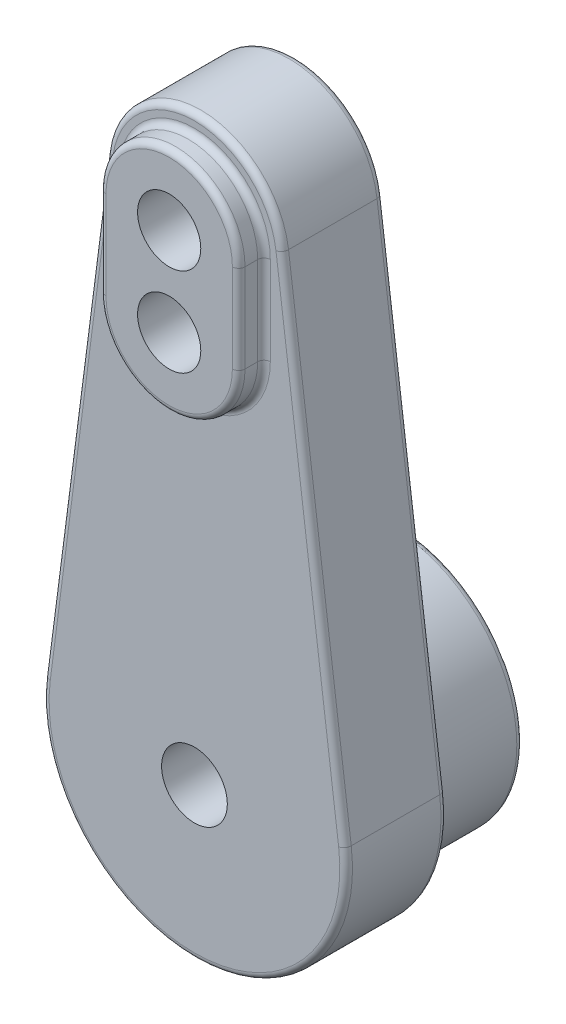
ISO-10303-21;
HEADER;
FILE_DESCRIPTION(('STEP AP214'),'2;1');
FILE_NAME('part.step','',(''),(''),'','','');
FILE_SCHEMA(('AUTOMOTIVE_DESIGN { 1 0 10303 214 1 1 1 1 }'));
ENDSEC;
DATA;
#1=APPLICATION_CONTEXT('core data for automotive mechanical design processes');
#2=APPLICATION_PROTOCOL_DEFINITION('international standard','automotive_design',2000,#1);
#3=PRODUCT_CONTEXT('',#1,'mechanical');
#4=PRODUCT('Part','Part','',(#3));
#5=PRODUCT_RELATED_PRODUCT_CATEGORY('part','',(#4));
#6=PRODUCT_DEFINITION_FORMATION('','',#4);
#7=PRODUCT_DEFINITION_CONTEXT('part definition',#1,'design');
#8=PRODUCT_DEFINITION('design','',#6,#7);
#9=PRODUCT_DEFINITION_SHAPE('','',#8);
#10=(LENGTH_UNIT() NAMED_UNIT(*) SI_UNIT(.MILLI.,.METRE.));
#11=(NAMED_UNIT(*) PLANE_ANGLE_UNIT() SI_UNIT($,.RADIAN.));
#12=(NAMED_UNIT(*) SI_UNIT($,.STERADIAN.) SOLID_ANGLE_UNIT());
#13=UNCERTAINTY_MEASURE_WITH_UNIT(LENGTH_MEASURE(1.E-05),#10,'distance_accuracy_value','');
#14=(GEOMETRIC_REPRESENTATION_CONTEXT(3) GLOBAL_UNCERTAINTY_ASSIGNED_CONTEXT((#13)) GLOBAL_UNIT_ASSIGNED_CONTEXT((#10,
#11,#12)) REPRESENTATION_CONTEXT('',''));
#15=CARTESIAN_POINT('',(0.,0.,0.));
#16=DIRECTION('',(0.,0.,1.));
#17=DIRECTION('',(1.,0.,0.));
#18=AXIS2_PLACEMENT_3D('',#15,#16,#17);
#19=CARTESIAN_POINT('',(0.,19.5,-4.));
#20=DIRECTION('',(0.,0.,1.));
#21=DIRECTION('',(1.,0.,0.));
#22=AXIS2_PLACEMENT_3D('',#19,#20,#21);
#23=PLANE('',#22);
#24=CARTESIAN_POINT('',(0.,0.,-4.));
#25=DIRECTION('',(0.,0.,1.));
#26=DIRECTION('',(1.,0.,0.));
#27=AXIS2_PLACEMENT_3D('',#24,#25,#26);
#28=CIRCLE('',#27,5.75);
#29=CARTESIAN_POINT('',(5.70254911453481,0.737179487179485,-4.));
#30=VERTEX_POINT('',#29);
#31=CARTESIAN_POINT('',(-5.70254911453481,0.737179487179487,-4.));
#32=VERTEX_POINT('',#31);
#33=EDGE_CURVE('E229',#30,#32,#28,.F.);
#34=ORIENTED_EDGE('',*,*,#33,.T.);
#35=DIRECTION('',(-0.128205128205128,-0.991747672093011,0.));
#36=VECTOR('',#35,1.);
#37=CARTESIAN_POINT('',(-3.22317993430229,19.9166666666667,-4.));
#38=LINE('',#37,#36);
#39=CARTESIAN_POINT('',(-3.22317993430229,19.9166666666667,-4.));
#40=VERTEX_POINT('',#39);
#41=EDGE_CURVE('E231',#32,#40,#38,.F.);
#42=ORIENTED_EDGE('',*,*,#41,.T.);
#43=CARTESIAN_POINT('',(0.,19.5,-4.));
#44=DIRECTION('',(0.,0.,1.));
#45=DIRECTION('',(1.,0.,0.));
#46=AXIS2_PLACEMENT_3D('',#43,#44,#45);
#47=CIRCLE('',#46,3.25);
#48=CARTESIAN_POINT('',(3.22317993430229,19.9166666666667,-4.));
#49=VERTEX_POINT('',#48);
#50=EDGE_CURVE('E56',#40,#49,#47,.F.);
#51=ORIENTED_EDGE('',*,*,#50,.T.);
#52=DIRECTION('',(-0.128205128205128,0.991747672093011,0.));
#53=VECTOR('',#52,1.);
#54=CARTESIAN_POINT('',(5.70254911453481,0.737179487179485,-4.));
#55=LINE('',#54,#53);
#56=EDGE_CURVE('E228',#49,#30,#55,.F.);
#57=ORIENTED_EDGE('',*,*,#56,.T.);
#58=EDGE_LOOP('',(#34,#42,#51,#57));
#59=FACE_BOUND('',#58,.T.);
#60=CARTESIAN_POINT('',(0.,0.,-4.));
#61=DIRECTION('',(0.,0.,1.));
#62=DIRECTION('',(1.,0.,0.));
#63=AXIS2_PLACEMENT_3D('',#60,#61,#62);
#64=CIRCLE('',#63,5.25);
#65=CARTESIAN_POINT('',(5.25,0.,-4.));
#66=VERTEX_POINT('',#65);
#67=EDGE_CURVE('E233',#66,#66,#64,.T.);
#68=ORIENTED_EDGE('',*,*,#67,.T.);
#69=EDGE_LOOP('',(#68));
#70=FACE_BOUND('',#69,.T.);
#71=CARTESIAN_POINT('',(0.,16.,-4.));
#72=DIRECTION('',(0.,0.,1.));
#73=DIRECTION('',(1.,0.,0.));
#74=AXIS2_PLACEMENT_3D('',#71,#72,#73);
#75=CIRCLE('',#74,1.25);
#76=CARTESIAN_POINT('',(1.25,16.,-4.));
#77=VERTEX_POINT('',#76);
#78=EDGE_CURVE('E258',#77,#77,#75,.T.);
#79=ORIENTED_EDGE('',*,*,#78,.T.);
#80=EDGE_LOOP('',(#79));
#81=FACE_BOUND('',#80,.T.);
#82=CARTESIAN_POINT('',(0.,19.5,-4.));
#83=DIRECTION('',(0.,0.,1.));
#84=DIRECTION('',(1.,0.,0.));
#85=AXIS2_PLACEMENT_3D('',#82,#83,#84);
#86=CIRCLE('',#85,1.25);
#87=CARTESIAN_POINT('',(1.25,19.5,-4.));
#88=VERTEX_POINT('',#87);
#89=EDGE_CURVE('E266',#88,#88,#86,.T.);
#90=ORIENTED_EDGE('',*,*,#89,.T.);
#91=EDGE_LOOP('',(#90));
#92=FACE_BOUND('',#91,.T.);
#93=ADVANCED_FACE('F32',(#59,#70,#81,#92),#23,.F.);
#94=CARTESIAN_POINT('',(0.,19.5,0.));
#95=DIRECTION('',(0.,0.,1.));
#96=DIRECTION('',(1.,0.,0.));
#97=AXIS2_PLACEMENT_3D('',#94,#95,#96);
#98=PLANE('',#97);
#99=DIRECTION('',(0.,1.,0.));
#100=VECTOR('',#99,1.);
#101=CARTESIAN_POINT('',(3.,19.5,0.));
#102=LINE('',#101,#100);
#103=CARTESIAN_POINT('',(3.,19.5,0.));
#104=VERTEX_POINT('',#103);
#105=CARTESIAN_POINT('',(3.,16.,0.));
#106=VERTEX_POINT('',#105);
#107=EDGE_CURVE('E309',#104,#106,#102,.F.);
#108=ORIENTED_EDGE('',*,*,#107,.T.);
#109=CARTESIAN_POINT('',(0.,16.,0.));
#110=DIRECTION('',(0.,0.,1.));
#111=DIRECTION('',(1.,0.,0.));
#112=AXIS2_PLACEMENT_3D('',#109,#110,#111);
#113=CIRCLE('',#112,3.);
#114=CARTESIAN_POINT('',(-3.,16.,0.));
#115=VERTEX_POINT('',#114);
#116=EDGE_CURVE('E315',#106,#115,#113,.F.);
#117=ORIENTED_EDGE('',*,*,#116,.T.);
#118=DIRECTION('',(0.,-1.,0.));
#119=VECTOR('',#118,1.);
#120=CARTESIAN_POINT('',(-3.,19.5,0.));
#121=LINE('',#120,#119);
#122=CARTESIAN_POINT('',(-3.,19.5,0.));
#123=VERTEX_POINT('',#122);
#124=EDGE_CURVE('E313',#115,#123,#121,.F.);
#125=ORIENTED_EDGE('',*,*,#124,.T.);
#126=CARTESIAN_POINT('',(0.,19.5,0.));
#127=DIRECTION('',(0.,0.,1.));
#128=DIRECTION('',(1.,0.,0.));
#129=AXIS2_PLACEMENT_3D('',#126,#127,#128);
#130=CIRCLE('',#129,3.);
#131=EDGE_CURVE('E311',#123,#104,#130,.F.);
#132=ORIENTED_EDGE('',*,*,#131,.T.);
#133=EDGE_LOOP('',(#108,#117,#125,#132));
#134=FACE_BOUND('',#133,.T.);
#135=CARTESIAN_POINT('',(0.,19.5,0.));
#136=DIRECTION('',(0.,0.,1.));
#137=DIRECTION('',(1.,0.,0.));
#138=AXIS2_PLACEMENT_3D('',#135,#136,#137);
#139=CIRCLE('',#138,3.25);
#140=CARTESIAN_POINT('',(3.22317993430229,19.9166666666667,0.));
#141=VERTEX_POINT('',#140);
#142=CARTESIAN_POINT('',(-3.22317993430229,19.9166666666667,0.));
#143=VERTEX_POINT('',#142);
#144=EDGE_CURVE('E300',#141,#143,#139,.T.);
#145=ORIENTED_EDGE('',*,*,#144,.T.);
#146=DIRECTION('',(-0.128205128205128,-0.991747672093011,0.));
#147=VECTOR('',#146,1.);
#148=CARTESIAN_POINT('',(-3.22317993430229,19.9166666666667,0.));
#149=LINE('',#148,#147);
#150=CARTESIAN_POINT('',(-5.70254911453481,0.737179487179487,0.));
#151=VERTEX_POINT('',#150);
#152=EDGE_CURVE('E306',#143,#151,#149,.T.);
#153=ORIENTED_EDGE('',*,*,#152,.T.);
#154=CARTESIAN_POINT('',(0.,0.,0.));
#155=DIRECTION('',(0.,0.,1.));
#156=DIRECTION('',(1.,0.,0.));
#157=AXIS2_PLACEMENT_3D('',#154,#155,#156);
#158=CIRCLE('',#157,5.75);
#159=CARTESIAN_POINT('',(5.70254911453481,0.737179487179485,0.));
#160=VERTEX_POINT('',#159);
#161=EDGE_CURVE('E304',#151,#160,#158,.T.);
#162=ORIENTED_EDGE('',*,*,#161,.T.);
#163=DIRECTION('',(-0.128205128205128,0.991747672093011,0.));
#164=VECTOR('',#163,1.);
#165=CARTESIAN_POINT('',(3.22317993430229,19.9166666666667,0.));
#166=LINE('',#165,#164);
#167=EDGE_CURVE('E302',#160,#141,#166,.T.);
#168=ORIENTED_EDGE('',*,*,#167,.T.);
#169=EDGE_LOOP('',(#145,#153,#162,#168));
#170=FACE_BOUND('',#169,.T.);
#171=CARTESIAN_POINT('',(0.,0.,0.));
#172=DIRECTION('',(0.,0.,1.));
#173=DIRECTION('',(1.,0.,0.));
#174=AXIS2_PLACEMENT_3D('',#171,#172,#173);
#175=CIRCLE('',#174,1.3);
#176=CARTESIAN_POINT('',(1.3,0.,0.));
#177=VERTEX_POINT('',#176);
#178=EDGE_CURVE('E282',#177,#177,#175,.T.);
#179=ORIENTED_EDGE('',*,*,#178,.F.);
#180=EDGE_LOOP('',(#179));
#181=FACE_BOUND('',#180,.T.);
#182=ADVANCED_FACE('F397',(#134,#170,#181),#98,.T.);
#183=CARTESIAN_POINT('',(0.,19.5,-4.));
#184=DIRECTION('',(0.,0.,1.));
#185=DIRECTION('',(1.,0.,0.));
#186=AXIS2_PLACEMENT_3D('',#183,#184,#185);
#187=CYLINDRICAL_SURFACE('',#186,3.5);
#188=DIRECTION('',(0.,0.,1.));
#189=VECTOR('',#188,1.);
#190=CARTESIAN_POINT('',(-3.47111685232554,19.9487179487179,-4.));
#191=LINE('',#190,#189);
#192=CARTESIAN_POINT('',(-3.47111685232554,19.9487179487179,-3.75));
#193=VERTEX_POINT('',#192);
#194=CARTESIAN_POINT('',(-3.47111685232554,19.9487179487179,-0.25));
#195=VERTEX_POINT('',#194);
#196=EDGE_CURVE('E286',#193,#195,#191,.T.);
#197=ORIENTED_EDGE('',*,*,#196,.T.);
#198=CARTESIAN_POINT('',(0.,19.5,-0.25));
#199=DIRECTION('',(0.,0.,1.));
#200=DIRECTION('',(1.,0.,0.));
#201=AXIS2_PLACEMENT_3D('',#198,#199,#200);
#202=CIRCLE('',#201,3.5);
#203=CARTESIAN_POINT('',(3.47111685232554,19.9487179487179,-0.25));
#204=VERTEX_POINT('',#203);
#205=EDGE_CURVE('E347',#195,#204,#202,.F.);
#206=ORIENTED_EDGE('',*,*,#205,.T.);
#207=DIRECTION('',(0.,0.,1.));
#208=VECTOR('',#207,1.);
#209=CARTESIAN_POINT('',(3.47111685232554,19.9487179487179,-4.));
#210=LINE('',#209,#208);
#211=CARTESIAN_POINT('',(3.47111685232554,19.9487179487179,-3.75));
#212=VERTEX_POINT('',#211);
#213=EDGE_CURVE('E183',#212,#204,#210,.T.);
#214=ORIENTED_EDGE('',*,*,#213,.F.);
#215=CARTESIAN_POINT('',(0.,19.5,-3.75));
#216=DIRECTION('',(0.,0.,1.));
#217=DIRECTION('',(1.,0.,0.));
#218=AXIS2_PLACEMENT_3D('',#215,#216,#217);
#219=CIRCLE('',#218,3.5);
#220=EDGE_CURVE('E223',#212,#193,#219,.T.);
#221=ORIENTED_EDGE('',*,*,#220,.T.);
#222=EDGE_LOOP('',(#197,#206,#214,#221));
#223=FACE_BOUND('',#222,.T.);
#224=ADVANCED_FACE('F399',(#223),#187,.T.);
#225=CARTESIAN_POINT('',(3.47111685232554,19.9487179487179,-4.));
#226=DIRECTION('',(0.991747672093011,0.128205128205128,0.));
#227=DIRECTION('',(-0.128205128205128,0.991747672093011,0.));
#228=AXIS2_PLACEMENT_3D('',#225,#226,#227);
#229=PLANE('',#228);
#230=ORIENTED_EDGE('',*,*,#213,.T.);
#231=DIRECTION('',(-0.128205128205128,0.991747672093011,0.));
#232=VECTOR('',#231,1.);
#233=CARTESIAN_POINT('',(3.47111685232554,19.9487179487179,-0.25));
#234=LINE('',#233,#232);
#235=CARTESIAN_POINT('',(5.95048603255807,0.769230769230767,-0.25));
#236=VERTEX_POINT('',#235);
#237=EDGE_CURVE('E344',#204,#236,#234,.F.);
#238=ORIENTED_EDGE('',*,*,#237,.T.);
#239=DIRECTION('',(0.,0.,1.));
#240=VECTOR('',#239,1.);
#241=CARTESIAN_POINT('',(5.95048603255807,0.769230769230767,-4.));
#242=LINE('',#241,#240);
#243=CARTESIAN_POINT('',(5.95048603255807,0.769230769230767,-3.75));
#244=VERTEX_POINT('',#243);
#245=EDGE_CURVE('E291',#244,#236,#242,.T.);
#246=ORIENTED_EDGE('',*,*,#245,.F.);
#247=DIRECTION('',(-0.128205128205128,0.991747672093011,0.));
#248=VECTOR('',#247,1.);
#249=CARTESIAN_POINT('',(3.47111685232554,19.9487179487179,-3.75));
#250=LINE('',#249,#248);
#251=EDGE_CURVE('E227',#244,#212,#250,.T.);
#252=ORIENTED_EDGE('',*,*,#251,.T.);
#253=EDGE_LOOP('',(#230,#238,#246,#252));
#254=FACE_BOUND('',#253,.T.);
#255=ADVANCED_FACE('F406',(#254),#229,.T.);
#256=CARTESIAN_POINT('',(0.,0.,-4.));
#257=DIRECTION('',(0.,0.,1.));
#258=DIRECTION('',(1.,0.,0.));
#259=AXIS2_PLACEMENT_3D('',#256,#257,#258);
#260=CYLINDRICAL_SURFACE('',#259,6.);
#261=ORIENTED_EDGE('',*,*,#245,.T.);
#262=CARTESIAN_POINT('',(0.,0.,-0.25));
#263=DIRECTION('',(0.,0.,1.));
#264=DIRECTION('',(1.,0.,0.));
#265=AXIS2_PLACEMENT_3D('',#262,#263,#264);
#266=CIRCLE('',#265,6.);
#267=CARTESIAN_POINT('',(-5.95048603255807,0.769230769230769,-0.25));
#268=VERTEX_POINT('',#267);
#269=EDGE_CURVE('E341',#236,#268,#266,.F.);
#270=ORIENTED_EDGE('',*,*,#269,.T.);
#271=DIRECTION('',(0.,0.,1.));
#272=VECTOR('',#271,1.);
#273=CARTESIAN_POINT('',(-5.95048603255807,0.769230769230769,-4.));
#274=LINE('',#273,#272);
#275=CARTESIAN_POINT('',(-5.95048603255807,0.769230769230769,-3.75));
#276=VERTEX_POINT('',#275);
#277=EDGE_CURVE('E294',#276,#268,#274,.T.);
#278=ORIENTED_EDGE('',*,*,#277,.F.);
#279=CARTESIAN_POINT('',(0.,0.,-3.75));
#280=DIRECTION('',(0.,0.,1.));
#281=DIRECTION('',(1.,0.,0.));
#282=AXIS2_PLACEMENT_3D('',#279,#280,#281);
#283=CIRCLE('',#282,6.);
#284=EDGE_CURVE('E339',#276,#244,#283,.T.);
#285=ORIENTED_EDGE('',*,*,#284,.T.);
#286=EDGE_LOOP('',(#261,#270,#278,#285));
#287=FACE_BOUND('',#286,.T.);
#288=ADVANCED_FACE('F413',(#287),#260,.T.);
#289=CARTESIAN_POINT('',(-3.47111685232554,19.9487179487179,-4.));
#290=DIRECTION('',(-0.991747672093011,0.128205128205128,0.));
#291=DIRECTION('',(-0.128205128205128,-0.991747672093011,0.));
#292=AXIS2_PLACEMENT_3D('',#289,#290,#291);
#293=PLANE('',#292);
#294=ORIENTED_EDGE('',*,*,#277,.T.);
#295=DIRECTION('',(-0.128205128205128,-0.991747672093011,0.));
#296=VECTOR('',#295,1.);
#297=CARTESIAN_POINT('',(-3.47111685232554,19.9487179487179,-0.25));
#298=LINE('',#297,#296);
#299=EDGE_CURVE('E336',#268,#195,#298,.F.);
#300=ORIENTED_EDGE('',*,*,#299,.T.);
#301=ORIENTED_EDGE('',*,*,#196,.F.);
#302=DIRECTION('',(-0.128205128205128,-0.991747672093011,0.));
#303=VECTOR('',#302,1.);
#304=CARTESIAN_POINT('',(-5.95048603255807,0.769230769230771,-3.75));
#305=LINE('',#304,#303);
#306=EDGE_CURVE('E333',#193,#276,#305,.T.);
#307=ORIENTED_EDGE('',*,*,#306,.T.);
#308=EDGE_LOOP('',(#294,#300,#301,#307));
#309=FACE_BOUND('',#308,.T.);
#310=ADVANCED_FACE('F387',(#309),#293,.T.);
#311=CARTESIAN_POINT('',(0.,0.,-4.));
#312=DIRECTION('',(0.,0.,-1.));
#313=DIRECTION('',(-1.,0.,0.));
#314=AXIS2_PLACEMENT_3D('',#311,#312,#313);
#315=CIRCLE('',#314,3.);
#316=CARTESIAN_POINT('',(-3.,0.,-4.));
#317=VERTEX_POINT('',#316);
#318=EDGE_CURVE('E269',#317,#317,#315,.T.);
#319=ORIENTED_EDGE('',*,*,#318,.T.);
#320=EDGE_LOOP('',(#319));
#321=FACE_BOUND('',#320,.T.);
#322=CARTESIAN_POINT('',(0.,0.,-4.));
#323=DIRECTION('',(0.,0.,1.));
#324=DIRECTION('',(1.,0.,0.));
#325=AXIS2_PLACEMENT_3D('',#322,#323,#324);
#326=CIRCLE('',#325,1.3);
#327=CARTESIAN_POINT('',(1.3,0.,-4.));
#328=VERTEX_POINT('',#327);
#329=EDGE_CURVE('E283',#328,#328,#326,.T.);
#330=ORIENTED_EDGE('',*,*,#329,.T.);
#331=EDGE_LOOP('',(#330));
#332=FACE_BOUND('',#331,.T.);
#333=ADVANCED_FACE('F383',(#321,#332),#23,.F.);
#334=CARTESIAN_POINT('',(0.,0.,-4.));
#335=DIRECTION('',(0.,0.,1.));
#336=DIRECTION('',(1.,0.,0.));
#337=AXIS2_PLACEMENT_3D('',#334,#335,#336);
#338=CYLINDRICAL_SURFACE('',#337,1.3);
#339=ORIENTED_EDGE('',*,*,#329,.F.);
#340=EDGE_LOOP('',(#339));
#341=FACE_BOUND('',#340,.T.);
#342=ORIENTED_EDGE('',*,*,#178,.T.);
#343=EDGE_LOOP('',(#342));
#344=FACE_BOUND('',#343,.T.);
#345=ADVANCED_FACE('F386',(#341,#344),#338,.F.);
#346=CARTESIAN_POINT('',(0.,19.5,1.));
#347=DIRECTION('',(0.,0.,-1.));
#348=DIRECTION('',(-1.,0.,0.));
#349=AXIS2_PLACEMENT_3D('',#346,#347,#348);
#350=CYLINDRICAL_SURFACE('',#349,2.75);
#351=DIRECTION('',(0.,0.,-1.));
#352=VECTOR('',#351,1.);
#353=CARTESIAN_POINT('',(2.75,19.5,1.));
#354=LINE('',#353,#352);
#355=CARTESIAN_POINT('',(2.75,19.5,0.75));
#356=VERTEX_POINT('',#355);
#357=CARTESIAN_POINT('',(2.75,19.5,0.25));
#358=VERTEX_POINT('',#357);
#359=EDGE_CURVE('E155',#356,#358,#354,.T.);
#360=ORIENTED_EDGE('',*,*,#359,.T.);
#361=CARTESIAN_POINT('',(0.,19.5,0.25));
#362=DIRECTION('',(0.,0.,1.));
#363=DIRECTION('',(1.,0.,0.));
#364=AXIS2_PLACEMENT_3D('',#361,#362,#363);
#365=CIRCLE('',#364,2.75);
#366=CARTESIAN_POINT('',(-2.75,19.5,0.25));
#367=VERTEX_POINT('',#366);
#368=EDGE_CURVE('E324',#358,#367,#365,.T.);
#369=ORIENTED_EDGE('',*,*,#368,.T.);
#370=DIRECTION('',(0.,0.,-1.));
#371=VECTOR('',#370,1.);
#372=CARTESIAN_POINT('',(-2.75,19.5,1.));
#373=LINE('',#372,#371);
#374=CARTESIAN_POINT('',(-2.75,19.5,0.75));
#375=VERTEX_POINT('',#374);
#376=EDGE_CURVE('E279',#375,#367,#373,.T.);
#377=ORIENTED_EDGE('',*,*,#376,.F.);
#378=CARTESIAN_POINT('',(0.,19.5,0.75));
#379=DIRECTION('',(0.,0.,-1.));
#380=DIRECTION('',(-1.,0.,0.));
#381=AXIS2_PLACEMENT_3D('',#378,#379,#380);
#382=CIRCLE('',#381,2.75);
#383=EDGE_CURVE('E322',#375,#356,#382,.T.);
#384=ORIENTED_EDGE('',*,*,#383,.T.);
#385=EDGE_LOOP('',(#360,#369,#377,#384));
#386=FACE_BOUND('',#385,.T.);
#387=ADVANCED_FACE('F393',(#386),#350,.T.);
#388=CARTESIAN_POINT('',(-2.75,19.5,1.));
#389=DIRECTION('',(1.,0.,0.));
#390=DIRECTION('',(0.,0.,-1.));
#391=AXIS2_PLACEMENT_3D('',#388,#389,#390);
#392=PLANE('',#391);
#393=ORIENTED_EDGE('',*,*,#376,.T.);
#394=DIRECTION('',(0.,-1.,0.));
#395=VECTOR('',#394,1.);
#396=CARTESIAN_POINT('',(-2.75,19.5,0.25));
#397=LINE('',#396,#395);
#398=CARTESIAN_POINT('',(-2.75,16.,0.25));
#399=VERTEX_POINT('',#398);
#400=EDGE_CURVE('E320',#367,#399,#397,.T.);
#401=ORIENTED_EDGE('',*,*,#400,.T.);
#402=DIRECTION('',(0.,0.,-1.));
#403=VECTOR('',#402,1.);
#404=CARTESIAN_POINT('',(-2.75,16.,1.));
#405=LINE('',#404,#403);
#406=CARTESIAN_POINT('',(-2.75,16.,0.75));
#407=VERTEX_POINT('',#406);
#408=EDGE_CURVE('E173',#407,#399,#405,.T.);
#409=ORIENTED_EDGE('',*,*,#408,.F.);
#410=DIRECTION('',(0.,-1.,0.));
#411=VECTOR('',#410,1.);
#412=CARTESIAN_POINT('',(-2.75,19.5,0.75));
#413=LINE('',#412,#411);
#414=EDGE_CURVE('E318',#407,#375,#413,.F.);
#415=ORIENTED_EDGE('',*,*,#414,.T.);
#416=EDGE_LOOP('',(#393,#401,#409,#415));
#417=FACE_BOUND('',#416,.T.);
#418=ADVANCED_FACE('F627',(#417),#392,.F.);
#419=CARTESIAN_POINT('',(0.,16.,1.));
#420=DIRECTION('',(0.,0.,-1.));
#421=DIRECTION('',(-1.,0.,0.));
#422=AXIS2_PLACEMENT_3D('',#419,#420,#421);
#423=CYLINDRICAL_SURFACE('',#422,2.75);
#424=ORIENTED_EDGE('',*,*,#408,.T.);
#425=CARTESIAN_POINT('',(0.,16.,0.25));
#426=DIRECTION('',(0.,0.,1.));
#427=DIRECTION('',(1.,0.,0.));
#428=AXIS2_PLACEMENT_3D('',#425,#426,#427);
#429=CIRCLE('',#428,2.75);
#430=CARTESIAN_POINT('',(2.75,16.,0.25));
#431=VERTEX_POINT('',#430);
#432=EDGE_CURVE('E172',#399,#431,#429,.T.);
#433=ORIENTED_EDGE('',*,*,#432,.T.);
#434=DIRECTION('',(0.,0.,-1.));
#435=VECTOR('',#434,1.);
#436=CARTESIAN_POINT('',(2.75,16.,1.));
#437=LINE('',#436,#435);
#438=CARTESIAN_POINT('',(2.75,16.,0.75));
#439=VERTEX_POINT('',#438);
#440=EDGE_CURVE('E153',#439,#431,#437,.T.);
#441=ORIENTED_EDGE('',*,*,#440,.F.);
#442=CARTESIAN_POINT('',(0.,16.,0.75));
#443=DIRECTION('',(0.,0.,-1.));
#444=DIRECTION('',(-1.,0.,0.));
#445=AXIS2_PLACEMENT_3D('',#442,#443,#444);
#446=CIRCLE('',#445,2.75);
#447=EDGE_CURVE('E169',#439,#407,#446,.T.);
#448=ORIENTED_EDGE('',*,*,#447,.T.);
#449=EDGE_LOOP('',(#424,#433,#441,#448));
#450=FACE_BOUND('',#449,.T.);
#451=ADVANCED_FACE('F168',(#450),#423,.T.);
#452=CARTESIAN_POINT('',(2.75,19.5,1.));
#453=DIRECTION('',(-1.,0.,0.));
#454=DIRECTION('',(0.,0.,1.));
#455=AXIS2_PLACEMENT_3D('',#452,#453,#454);
#456=PLANE('',#455);
#457=ORIENTED_EDGE('',*,*,#440,.T.);
#458=DIRECTION('',(0.,1.,0.));
#459=VECTOR('',#458,1.);
#460=CARTESIAN_POINT('',(2.75,19.5,0.25));
#461=LINE('',#460,#459);
#462=EDGE_CURVE('E160',#431,#358,#461,.T.);
#463=ORIENTED_EDGE('',*,*,#462,.T.);
#464=ORIENTED_EDGE('',*,*,#359,.F.);
#465=DIRECTION('',(0.,1.,0.));
#466=VECTOR('',#465,1.);
#467=CARTESIAN_POINT('',(2.75,19.5,0.75));
#468=LINE('',#467,#466);
#469=EDGE_CURVE('E150',#356,#439,#468,.F.);
#470=ORIENTED_EDGE('',*,*,#469,.T.);
#471=EDGE_LOOP('',(#457,#463,#464,#470));
#472=FACE_BOUND('',#471,.T.);
#473=ADVANCED_FACE('F152',(#472),#456,.F.);
#474=CARTESIAN_POINT('',(0.,19.5,1.));
#475=DIRECTION('',(0.,0.,-1.));
#476=DIRECTION('',(-1.,0.,0.));
#477=AXIS2_PLACEMENT_3D('',#474,#475,#476);
#478=PLANE('',#477);
#479=DIRECTION('',(0.,-1.,0.));
#480=VECTOR('',#479,1.);
#481=CARTESIAN_POINT('',(-2.5,19.5,1.));
#482=LINE('',#481,#480);
#483=CARTESIAN_POINT('',(-2.5,19.5,1.));
#484=VERTEX_POINT('',#483);
#485=CARTESIAN_POINT('',(-2.5,16.,1.));
#486=VERTEX_POINT('',#485);
#487=EDGE_CURVE('E329',#484,#486,#482,.T.);
#488=ORIENTED_EDGE('',*,*,#487,.T.);
#489=CARTESIAN_POINT('',(0.,16.,1.));
#490=DIRECTION('',(0.,0.,-1.));
#491=DIRECTION('',(-1.,0.,0.));
#492=AXIS2_PLACEMENT_3D('',#489,#490,#491);
#493=CIRCLE('',#492,2.5);
#494=CARTESIAN_POINT('',(2.5,16.,1.));
#495=VERTEX_POINT('',#494);
#496=EDGE_CURVE('E161',#486,#495,#493,.F.);
#497=ORIENTED_EDGE('',*,*,#496,.T.);
#498=DIRECTION('',(0.,1.,0.));
#499=VECTOR('',#498,1.);
#500=CARTESIAN_POINT('',(2.5,19.5,1.));
#501=LINE('',#500,#499);
#502=CARTESIAN_POINT('',(2.5,19.5,1.));
#503=VERTEX_POINT('',#502);
#504=EDGE_CURVE('E186',#495,#503,#501,.T.);
#505=ORIENTED_EDGE('',*,*,#504,.T.);
#506=CARTESIAN_POINT('',(0.,19.5,1.));
#507=DIRECTION('',(0.,0.,-1.));
#508=DIRECTION('',(-1.,0.,0.));
#509=AXIS2_PLACEMENT_3D('',#506,#507,#508);
#510=CIRCLE('',#509,2.5);
#511=EDGE_CURVE('E327',#503,#484,#510,.F.);
#512=ORIENTED_EDGE('',*,*,#511,.T.);
#513=EDGE_LOOP('',(#488,#497,#505,#512));
#514=FACE_BOUND('',#513,.T.);
#515=CARTESIAN_POINT('',(0.,16.,1.));
#516=DIRECTION('',(0.,0.,1.));
#517=DIRECTION('',(1.,0.,0.));
#518=AXIS2_PLACEMENT_3D('',#515,#516,#517);
#519=CIRCLE('',#518,1.25);
#520=CARTESIAN_POINT('',(1.25,16.,1.));
#521=VERTEX_POINT('',#520);
#522=EDGE_CURVE('E252',#521,#521,#519,.T.);
#523=ORIENTED_EDGE('',*,*,#522,.F.);
#524=EDGE_LOOP('',(#523));
#525=FACE_BOUND('',#524,.T.);
#526=CARTESIAN_POINT('',(0.,19.5,1.));
#527=DIRECTION('',(0.,0.,1.));
#528=DIRECTION('',(1.,0.,0.));
#529=AXIS2_PLACEMENT_3D('',#526,#527,#528);
#530=CIRCLE('',#529,1.25);
#531=CARTESIAN_POINT('',(1.25,19.5,1.));
#532=VERTEX_POINT('',#531);
#533=EDGE_CURVE('E263',#532,#532,#530,.T.);
#534=ORIENTED_EDGE('',*,*,#533,.F.);
#535=EDGE_LOOP('',(#534));
#536=FACE_BOUND('',#535,.T.);
#537=ADVANCED_FACE('F373',(#514,#525,#536),#478,.F.);
#538=CARTESIAN_POINT('',(0.,0.,-8.));
#539=DIRECTION('',(0.,0.,-1.));
#540=DIRECTION('',(-1.,0.,0.));
#541=AXIS2_PLACEMENT_3D('',#538,#539,#540);
#542=PLANE('',#541);
#543=CARTESIAN_POINT('',(0.,0.,-8.));
#544=DIRECTION('',(0.,0.,-1.));
#545=DIRECTION('',(-1.,0.,0.));
#546=AXIS2_PLACEMENT_3D('',#543,#544,#545);
#547=CIRCLE('',#546,4.75);
#548=CARTESIAN_POINT('',(-4.75,0.,-8.));
#549=VERTEX_POINT('',#548);
#550=EDGE_CURVE('E11',#549,#549,#547,.T.);
#551=ORIENTED_EDGE('',*,*,#550,.T.);
#552=EDGE_LOOP('',(#551));
#553=FACE_BOUND('',#552,.T.);
#554=CARTESIAN_POINT('',(0.,0.,-8.));
#555=DIRECTION('',(0.,0.,-1.));
#556=DIRECTION('',(-1.,0.,0.));
#557=AXIS2_PLACEMENT_3D('',#554,#555,#556);
#558=CIRCLE('',#557,3.);
#559=CARTESIAN_POINT('',(-3.,0.,-8.));
#560=VERTEX_POINT('',#559);
#561=EDGE_CURVE('E272',#560,#560,#558,.T.);
#562=ORIENTED_EDGE('',*,*,#561,.F.);
#563=EDGE_LOOP('',(#562));
#564=FACE_BOUND('',#563,.T.);
#565=ADVANCED_FACE('F363',(#553,#564),#542,.T.);
#566=CARTESIAN_POINT('',(0.,0.,-8.));
#567=DIRECTION('',(0.,0.,1.));
#568=DIRECTION('',(1.,0.,0.));
#569=AXIS2_PLACEMENT_3D('',#566,#567,#568);
#570=CYLINDRICAL_SURFACE('',#569,5.);
#571=CARTESIAN_POINT('',(0.,0.,-4.25));
#572=DIRECTION('',(0.,0.,1.));
#573=DIRECTION('',(1.,0.,0.));
#574=AXIS2_PLACEMENT_3D('',#571,#572,#573);
#575=CIRCLE('',#574,5.);
#576=CARTESIAN_POINT('',(5.,0.,-4.25));
#577=VERTEX_POINT('',#576);
#578=EDGE_CURVE('E41',#577,#577,#575,.F.);
#579=ORIENTED_EDGE('',*,*,#578,.T.);
#580=EDGE_LOOP('',(#579));
#581=FACE_BOUND('',#580,.T.);
#582=CARTESIAN_POINT('',(0.,0.,-7.75));
#583=DIRECTION('',(0.,0.,-1.));
#584=DIRECTION('',(-1.,0.,0.));
#585=AXIS2_PLACEMENT_3D('',#582,#583,#584);
#586=CIRCLE('',#585,5.);
#587=CARTESIAN_POINT('',(-5.,0.,-7.75));
#588=VERTEX_POINT('',#587);
#589=EDGE_CURVE('E238',#588,#588,#586,.F.);
#590=ORIENTED_EDGE('',*,*,#589,.T.);
#591=EDGE_LOOP('',(#590));
#592=FACE_BOUND('',#591,.T.);
#593=ADVANCED_FACE('F359',(#581,#592),#570,.T.);
#594=CARTESIAN_POINT('',(0.,0.,-8.));
#595=DIRECTION('',(0.,0.,1.));
#596=DIRECTION('',(1.,0.,0.));
#597=AXIS2_PLACEMENT_3D('',#594,#595,#596);
#598=CYLINDRICAL_SURFACE('',#597,3.);
#599=ORIENTED_EDGE('',*,*,#561,.T.);
#600=EDGE_LOOP('',(#599));
#601=FACE_BOUND('',#600,.T.);
#602=ORIENTED_EDGE('',*,*,#318,.F.);
#603=EDGE_LOOP('',(#602));
#604=FACE_BOUND('',#603,.T.);
#605=ADVANCED_FACE('F362',(#601,#604),#598,.F.);
#606=CARTESIAN_POINT('',(0.,19.5,-4.));
#607=DIRECTION('',(0.,0.,1.));
#608=DIRECTION('',(1.,0.,0.));
#609=AXIS2_PLACEMENT_3D('',#606,#607,#608);
#610=CYLINDRICAL_SURFACE('',#609,1.25);
#611=ORIENTED_EDGE('',*,*,#89,.F.);
#612=EDGE_LOOP('',(#611));
#613=FACE_BOUND('',#612,.T.);
#614=ORIENTED_EDGE('',*,*,#533,.T.);
#615=EDGE_LOOP('',(#614));
#616=FACE_BOUND('',#615,.T.);
#617=ADVANCED_FACE('F379',(#613,#616),#610,.F.);
#618=CARTESIAN_POINT('',(0.,16.,-4.));
#619=DIRECTION('',(0.,0.,1.));
#620=DIRECTION('',(1.,0.,0.));
#621=AXIS2_PLACEMENT_3D('',#618,#619,#620);
#622=CYLINDRICAL_SURFACE('',#621,1.25);
#623=ORIENTED_EDGE('',*,*,#78,.F.);
#624=EDGE_LOOP('',(#623));
#625=FACE_BOUND('',#624,.T.);
#626=ORIENTED_EDGE('',*,*,#522,.T.);
#627=EDGE_LOOP('',(#626));
#628=FACE_BOUND('',#627,.T.);
#629=ADVANCED_FACE('F435',(#625,#628),#622,.F.);
#630=CARTESIAN_POINT('',(0.,19.5,0.25));
#631=DIRECTION('',(0.,0.,1.));
#632=DIRECTION('',(1.,0.,0.));
#633=AXIS2_PLACEMENT_3D('',#630,#631,#632);
#634=TOROIDAL_SURFACE('',#633,3.,0.25);
#635=CARTESIAN_POINT('',(3.,19.5,0.25));
#636=DIRECTION('',(0.,1.,0.));
#637=DIRECTION('',(0.,0.,1.));
#638=AXIS2_PLACEMENT_3D('',#635,#636,#637);
#639=CIRCLE('',#638,0.25);
#640=EDGE_CURVE('E245',#104,#358,#639,.T.);
#641=ORIENTED_EDGE('',*,*,#640,.F.);
#642=ORIENTED_EDGE('',*,*,#131,.F.);
#643=CARTESIAN_POINT('',(-3.,19.5,0.25));
#644=DIRECTION('',(0.,1.,0.));
#645=DIRECTION('',(0.,0.,1.));
#646=AXIS2_PLACEMENT_3D('',#643,#644,#645);
#647=CIRCLE('',#646,0.25);
#648=EDGE_CURVE('E196',#367,#123,#647,.T.);
#649=ORIENTED_EDGE('',*,*,#648,.F.);
#650=ORIENTED_EDGE('',*,*,#368,.F.);
#651=EDGE_LOOP('',(#641,#642,#649,#650));
#652=FACE_BOUND('',#651,.T.);
#653=ADVANCED_FACE('F432',(#652),#634,.F.);
#654=CARTESIAN_POINT('',(-3.,19.5,0.25));
#655=DIRECTION('',(0.,-1.,0.));
#656=DIRECTION('',(0.,0.,-1.));
#657=AXIS2_PLACEMENT_3D('',#654,#655,#656);
#658=CYLINDRICAL_SURFACE('',#657,0.25);
#659=ORIENTED_EDGE('',*,*,#648,.T.);
#660=ORIENTED_EDGE('',*,*,#124,.F.);
#661=CARTESIAN_POINT('',(-3.,16.,0.25));
#662=DIRECTION('',(0.,1.,0.));
#663=DIRECTION('',(0.,0.,1.));
#664=AXIS2_PLACEMENT_3D('',#661,#662,#663);
#665=CIRCLE('',#664,0.25);
#666=EDGE_CURVE('E244',#399,#115,#665,.T.);
#667=ORIENTED_EDGE('',*,*,#666,.F.);
#668=ORIENTED_EDGE('',*,*,#400,.F.);
#669=EDGE_LOOP('',(#659,#660,#667,#668));
#670=FACE_BOUND('',#669,.T.);
#671=ADVANCED_FACE('F429',(#670),#658,.F.);
#672=CARTESIAN_POINT('',(3.,19.5,0.25));
#673=DIRECTION('',(0.,1.,0.));
#674=DIRECTION('',(0.,0.,1.));
#675=AXIS2_PLACEMENT_3D('',#672,#673,#674);
#676=CYLINDRICAL_SURFACE('',#675,0.25);
#677=ORIENTED_EDGE('',*,*,#640,.T.);
#678=ORIENTED_EDGE('',*,*,#462,.F.);
#679=CARTESIAN_POINT('',(3.,16.,0.25));
#680=DIRECTION('',(0.,1.,0.));
#681=DIRECTION('',(0.,0.,1.));
#682=AXIS2_PLACEMENT_3D('',#679,#680,#681);
#683=CIRCLE('',#682,0.25);
#684=EDGE_CURVE('E203',#106,#431,#683,.T.);
#685=ORIENTED_EDGE('',*,*,#684,.F.);
#686=ORIENTED_EDGE('',*,*,#107,.F.);
#687=EDGE_LOOP('',(#677,#678,#685,#686));
#688=FACE_BOUND('',#687,.T.);
#689=ADVANCED_FACE('F425',(#688),#676,.F.);
#690=CARTESIAN_POINT('',(0.,16.,0.25));
#691=DIRECTION('',(0.,0.,1.));
#692=DIRECTION('',(1.,0.,0.));
#693=AXIS2_PLACEMENT_3D('',#690,#691,#692);
#694=TOROIDAL_SURFACE('',#693,3.,0.25);
#695=ORIENTED_EDGE('',*,*,#666,.T.);
#696=ORIENTED_EDGE('',*,*,#116,.F.);
#697=ORIENTED_EDGE('',*,*,#684,.T.);
#698=ORIENTED_EDGE('',*,*,#432,.F.);
#699=EDGE_LOOP('',(#695,#696,#697,#698));
#700=FACE_BOUND('',#699,.T.);
#701=ADVANCED_FACE('F421',(#700),#694,.F.);
#702=CARTESIAN_POINT('',(0.,19.5,0.75));
#703=DIRECTION('',(0.,0.,-1.));
#704=DIRECTION('',(-1.,0.,0.));
#705=AXIS2_PLACEMENT_3D('',#702,#703,#704);
#706=TOROIDAL_SURFACE('',#705,2.5,0.25);
#707=CARTESIAN_POINT('',(2.5,19.5,0.75));
#708=DIRECTION('',(0.,-1.,0.));
#709=DIRECTION('',(0.,0.,-1.));
#710=AXIS2_PLACEMENT_3D('',#707,#708,#709);
#711=CIRCLE('',#710,0.25);
#712=EDGE_CURVE('E190',#356,#503,#711,.T.);
#713=ORIENTED_EDGE('',*,*,#712,.F.);
#714=ORIENTED_EDGE('',*,*,#383,.F.);
#715=CARTESIAN_POINT('',(-2.5,19.5,0.75));
#716=DIRECTION('',(0.,-1.,0.));
#717=DIRECTION('',(0.,0.,-1.));
#718=AXIS2_PLACEMENT_3D('',#715,#716,#717);
#719=CIRCLE('',#718,0.25);
#720=EDGE_CURVE('E200',#484,#375,#719,.T.);
#721=ORIENTED_EDGE('',*,*,#720,.F.);
#722=ORIENTED_EDGE('',*,*,#511,.F.);
#723=EDGE_LOOP('',(#713,#714,#721,#722));
#724=FACE_BOUND('',#723,.T.);
#725=ADVANCED_FACE('F424',(#724),#706,.T.);
#726=CARTESIAN_POINT('',(-2.5,19.5,0.75));
#727=DIRECTION('',(0.,-1.,0.));
#728=DIRECTION('',(0.,0.,-1.));
#729=AXIS2_PLACEMENT_3D('',#726,#727,#728);
#730=CYLINDRICAL_SURFACE('',#729,0.25);
#731=ORIENTED_EDGE('',*,*,#720,.T.);
#732=ORIENTED_EDGE('',*,*,#414,.F.);
#733=CARTESIAN_POINT('',(-2.5,16.,0.75));
#734=DIRECTION('',(0.,-1.,0.));
#735=DIRECTION('',(0.,0.,-1.));
#736=AXIS2_PLACEMENT_3D('',#733,#734,#735);
#737=CIRCLE('',#736,0.25);
#738=EDGE_CURVE('E181',#486,#407,#737,.T.);
#739=ORIENTED_EDGE('',*,*,#738,.F.);
#740=ORIENTED_EDGE('',*,*,#487,.F.);
#741=EDGE_LOOP('',(#731,#732,#739,#740));
#742=FACE_BOUND('',#741,.T.);
#743=ADVANCED_FACE('F442',(#742),#730,.T.);
#744=CARTESIAN_POINT('',(2.5,19.5,0.75));
#745=DIRECTION('',(0.,1.,0.));
#746=DIRECTION('',(0.,0.,1.));
#747=AXIS2_PLACEMENT_3D('',#744,#745,#746);
#748=CYLINDRICAL_SURFACE('',#747,0.25);
#749=ORIENTED_EDGE('',*,*,#712,.T.);
#750=ORIENTED_EDGE('',*,*,#504,.F.);
#751=CARTESIAN_POINT('',(2.5,16.,0.75));
#752=DIRECTION('',(0.,-1.,0.));
#753=DIRECTION('',(0.,0.,-1.));
#754=AXIS2_PLACEMENT_3D('',#751,#752,#753);
#755=CIRCLE('',#754,0.25);
#756=EDGE_CURVE('E178',#439,#495,#755,.T.);
#757=ORIENTED_EDGE('',*,*,#756,.F.);
#758=ORIENTED_EDGE('',*,*,#469,.F.);
#759=EDGE_LOOP('',(#749,#750,#757,#758));
#760=FACE_BOUND('',#759,.T.);
#761=ADVANCED_FACE('F185',(#760),#748,.T.);
#762=CARTESIAN_POINT('',(0.,16.,0.75));
#763=DIRECTION('',(0.,0.,-1.));
#764=DIRECTION('',(-1.,0.,0.));
#765=AXIS2_PLACEMENT_3D('',#762,#763,#764);
#766=TOROIDAL_SURFACE('',#765,2.5,0.25);
#767=ORIENTED_EDGE('',*,*,#738,.T.);
#768=ORIENTED_EDGE('',*,*,#447,.F.);
#769=ORIENTED_EDGE('',*,*,#756,.T.);
#770=ORIENTED_EDGE('',*,*,#496,.F.);
#771=EDGE_LOOP('',(#767,#768,#769,#770));
#772=FACE_BOUND('',#771,.T.);
#773=ADVANCED_FACE('F176',(#772),#766,.T.);
#774=CARTESIAN_POINT('',(3.22317993430229,19.9166666666667,-0.25));
#775=DIRECTION('',(-0.128205128205128,0.991747672093011,0.));
#776=DIRECTION('',(-0.991747672093011,-0.128205128205128,0.));
#777=AXIS2_PLACEMENT_3D('',#774,#775,#776);
#778=CYLINDRICAL_SURFACE('',#777,0.25);
#779=CARTESIAN_POINT('',(5.70254911453481,0.737179487179485,-0.25));
#780=DIRECTION('',(0.128205128205128,-0.991747672093011,0.));
#781=DIRECTION('',(0.991747672093011,0.128205128205128,0.));
#782=AXIS2_PLACEMENT_3D('',#779,#780,#781);
#783=CIRCLE('',#782,0.25);
#784=EDGE_CURVE('E193',#236,#160,#783,.T.);
#785=ORIENTED_EDGE('',*,*,#784,.F.);
#786=ORIENTED_EDGE('',*,*,#237,.F.);
#787=CARTESIAN_POINT('',(3.22317993430229,19.9166666666667,-0.25));
#788=DIRECTION('',(-0.128205128205133,0.991747672093011,0.));
#789=DIRECTION('',(-0.991747672093011,-0.128205128205133,0.));
#790=AXIS2_PLACEMENT_3D('',#787,#788,#789);
#791=CIRCLE('',#790,0.25);
#792=EDGE_CURVE('E188',#141,#204,#791,.T.);
#793=ORIENTED_EDGE('',*,*,#792,.F.);
#794=ORIENTED_EDGE('',*,*,#167,.F.);
#795=EDGE_LOOP('',(#785,#786,#793,#794));
#796=FACE_BOUND('',#795,.T.);
#797=ADVANCED_FACE('F439',(#796),#778,.T.);
#798=CARTESIAN_POINT('',(0.,19.5,-0.25));
#799=DIRECTION('',(0.,0.,1.));
#800=DIRECTION('',(1.,0.,0.));
#801=AXIS2_PLACEMENT_3D('',#798,#799,#800);
#802=TOROIDAL_SURFACE('',#801,3.25,0.25);
#803=ORIENTED_EDGE('',*,*,#792,.T.);
#804=ORIENTED_EDGE('',*,*,#205,.F.);
#805=CARTESIAN_POINT('',(-3.22317993430229,19.9166666666667,-0.25));
#806=DIRECTION('',(-0.128205128205133,-0.991747672093011,0.));
#807=DIRECTION('',(0.991747672093011,-0.128205128205133,0.));
#808=AXIS2_PLACEMENT_3D('',#805,#806,#807);
#809=CIRCLE('',#808,0.25);
#810=EDGE_CURVE('E206',#143,#195,#809,.T.);
#811=ORIENTED_EDGE('',*,*,#810,.F.);
#812=ORIENTED_EDGE('',*,*,#144,.F.);
#813=EDGE_LOOP('',(#803,#804,#811,#812));
#814=FACE_BOUND('',#813,.T.);
#815=ADVANCED_FACE('F456',(#814),#802,.T.);
#816=CARTESIAN_POINT('',(0.,0.,-0.25));
#817=DIRECTION('',(0.,0.,1.));
#818=DIRECTION('',(1.,0.,0.));
#819=AXIS2_PLACEMENT_3D('',#816,#817,#818);
#820=TOROIDAL_SURFACE('',#819,5.75,0.25);
#821=ORIENTED_EDGE('',*,*,#784,.T.);
#822=ORIENTED_EDGE('',*,*,#161,.F.);
#823=CARTESIAN_POINT('',(-5.70254911453481,0.737179487179487,-0.25));
#824=DIRECTION('',(0.128205128205128,0.991747672093011,0.));
#825=DIRECTION('',(-0.991747672093011,0.128205128205128,0.));
#826=AXIS2_PLACEMENT_3D('',#823,#824,#825);
#827=CIRCLE('',#826,0.25);
#828=EDGE_CURVE('E204',#268,#151,#827,.T.);
#829=ORIENTED_EDGE('',*,*,#828,.F.);
#830=ORIENTED_EDGE('',*,*,#269,.F.);
#831=EDGE_LOOP('',(#821,#822,#829,#830));
#832=FACE_BOUND('',#831,.T.);
#833=ADVANCED_FACE('F452',(#832),#820,.T.);
#834=CARTESIAN_POINT('',(-3.22317993430229,19.9166666666667,-0.25));
#835=DIRECTION('',(-0.128205128205128,-0.991747672093011,0.));
#836=DIRECTION('',(0.991747672093011,-0.128205128205128,0.));
#837=AXIS2_PLACEMENT_3D('',#834,#835,#836);
#838=CYLINDRICAL_SURFACE('',#837,0.25);
#839=ORIENTED_EDGE('',*,*,#810,.T.);
#840=ORIENTED_EDGE('',*,*,#299,.F.);
#841=ORIENTED_EDGE('',*,*,#828,.T.);
#842=ORIENTED_EDGE('',*,*,#152,.F.);
#843=EDGE_LOOP('',(#839,#840,#841,#842));
#844=FACE_BOUND('',#843,.T.);
#845=ADVANCED_FACE('F449',(#844),#838,.T.);
#846=CARTESIAN_POINT('',(3.22317993430229,19.9166666666667,-3.75));
#847=DIRECTION('',(0.128205128205128,-0.991747672093011,0.));
#848=DIRECTION('',(0.991747672093011,0.128205128205128,0.));
#849=AXIS2_PLACEMENT_3D('',#846,#847,#848);
#850=CYLINDRICAL_SURFACE('',#849,0.25);
#851=CARTESIAN_POINT('',(5.70254911453481,0.737179487179485,-3.75));
#852=DIRECTION('',(0.128205128205128,-0.991747672093011,0.));
#853=DIRECTION('',(0.991747672093011,0.128205128205128,0.));
#854=AXIS2_PLACEMENT_3D('',#851,#852,#853);
#855=CIRCLE('',#854,0.25);
#856=EDGE_CURVE('E212',#30,#244,#855,.T.);
#857=ORIENTED_EDGE('',*,*,#856,.F.);
#858=ORIENTED_EDGE('',*,*,#56,.F.);
#859=CARTESIAN_POINT('',(3.22317993430229,19.9166666666667,-3.75));
#860=DIRECTION('',(-0.128205128205133,0.991747672093011,0.));
#861=DIRECTION('',(-0.991747672093011,-0.128205128205133,0.));
#862=AXIS2_PLACEMENT_3D('',#859,#860,#861);
#863=CIRCLE('',#862,0.25);
#864=EDGE_CURVE('E36',#212,#49,#863,.T.);
#865=ORIENTED_EDGE('',*,*,#864,.F.);
#866=ORIENTED_EDGE('',*,*,#251,.F.);
#867=EDGE_LOOP('',(#857,#858,#865,#866));
#868=FACE_BOUND('',#867,.T.);
#869=ADVANCED_FACE('F226',(#868),#850,.T.);
#870=CARTESIAN_POINT('',(0.,19.5,-3.75));
#871=DIRECTION('',(0.,0.,1.));
#872=DIRECTION('',(1.,0.,0.));
#873=AXIS2_PLACEMENT_3D('',#870,#871,#872);
#874=TOROIDAL_SURFACE('',#873,3.25,0.25);
#875=ORIENTED_EDGE('',*,*,#864,.T.);
#876=ORIENTED_EDGE('',*,*,#50,.F.);
#877=CARTESIAN_POINT('',(-3.22317993430229,19.9166666666667,-3.75));
#878=DIRECTION('',(-0.128205128205133,-0.991747672093011,0.));
#879=DIRECTION('',(0.991747672093011,-0.128205128205133,0.));
#880=AXIS2_PLACEMENT_3D('',#877,#878,#879);
#881=CIRCLE('',#880,0.25);
#882=EDGE_CURVE('E49',#193,#40,#881,.T.);
#883=ORIENTED_EDGE('',*,*,#882,.F.);
#884=ORIENTED_EDGE('',*,*,#220,.F.);
#885=EDGE_LOOP('',(#875,#876,#883,#884));
#886=FACE_BOUND('',#885,.T.);
#887=ADVANCED_FACE('F222',(#886),#874,.T.);
#888=CARTESIAN_POINT('',(0.,0.,-3.75));
#889=DIRECTION('',(0.,0.,1.));
#890=DIRECTION('',(1.,0.,0.));
#891=AXIS2_PLACEMENT_3D('',#888,#889,#890);
#892=TOROIDAL_SURFACE('',#891,5.75,0.25);
#893=ORIENTED_EDGE('',*,*,#856,.T.);
#894=ORIENTED_EDGE('',*,*,#284,.F.);
#895=CARTESIAN_POINT('',(-5.70254911453481,0.737179487179487,-3.75));
#896=DIRECTION('',(0.128205128205128,0.991747672093011,0.));
#897=DIRECTION('',(-0.991747672093011,0.128205128205128,0.));
#898=AXIS2_PLACEMENT_3D('',#895,#896,#897);
#899=CIRCLE('',#898,0.25);
#900=EDGE_CURVE('E210',#32,#276,#899,.T.);
#901=ORIENTED_EDGE('',*,*,#900,.F.);
#902=ORIENTED_EDGE('',*,*,#33,.F.);
#903=EDGE_LOOP('',(#893,#894,#901,#902));
#904=FACE_BOUND('',#903,.T.);
#905=ADVANCED_FACE('F466',(#904),#892,.T.);
#906=CARTESIAN_POINT('',(-3.22317993430229,19.9166666666667,-3.75));
#907=DIRECTION('',(0.128205128205128,0.991747672093011,0.));
#908=DIRECTION('',(-0.991747672093011,0.128205128205128,0.));
#909=AXIS2_PLACEMENT_3D('',#906,#907,#908);
#910=CYLINDRICAL_SURFACE('',#909,0.25);
#911=ORIENTED_EDGE('',*,*,#882,.T.);
#912=ORIENTED_EDGE('',*,*,#41,.F.);
#913=ORIENTED_EDGE('',*,*,#900,.T.);
#914=ORIENTED_EDGE('',*,*,#306,.F.);
#915=EDGE_LOOP('',(#911,#912,#913,#914));
#916=FACE_BOUND('',#915,.T.);
#917=ADVANCED_FACE('F356',(#916),#910,.T.);
#918=CARTESIAN_POINT('',(0.,0.,-4.25));
#919=DIRECTION('',(0.,0.,1.));
#920=DIRECTION('',(1.,0.,0.));
#921=AXIS2_PLACEMENT_3D('',#918,#919,#920);
#922=TOROIDAL_SURFACE('',#921,5.25,0.25);
#923=ORIENTED_EDGE('',*,*,#67,.F.);
#924=EDGE_LOOP('',(#923));
#925=FACE_BOUND('',#924,.T.);
#926=ORIENTED_EDGE('',*,*,#578,.F.);
#927=EDGE_LOOP('',(#926));
#928=FACE_BOUND('',#927,.T.);
#929=ADVANCED_FACE('F353',(#925,#928),#922,.F.);
#930=CARTESIAN_POINT('',(0.,0.,-7.75));
#931=DIRECTION('',(0.,0.,-1.));
#932=DIRECTION('',(-1.,0.,0.));
#933=AXIS2_PLACEMENT_3D('',#930,#931,#932);
#934=TOROIDAL_SURFACE('',#933,4.75,0.25);
#935=ORIENTED_EDGE('',*,*,#589,.F.);
#936=EDGE_LOOP('',(#935));
#937=FACE_BOUND('',#936,.T.);
#938=ORIENTED_EDGE('',*,*,#550,.F.);
#939=EDGE_LOOP('',(#938));
#940=FACE_BOUND('',#939,.T.);
#941=ADVANCED_FACE('F34',(#937,#940),#934,.T.);
#942=CLOSED_SHELL('',(#93,#182,#224,#255,#288,#310,#333,#345,#387,#418,#451,#473,#537,#565,#593,
#605,#617,#629,#653,#671,#689,#701,#725,#743,#761,#773,#797,#815,#833,#845,#869,#887,#905,#917,
#929,#941));
#943=MANIFOLD_SOLID_BREP('B2',#942);
#944=ADVANCED_BREP_SHAPE_REPRESENTATION('',(#18,#943),#14);
#945=SHAPE_DEFINITION_REPRESENTATION(#9,#944);
ENDSEC;
END-ISO-10303-21;
